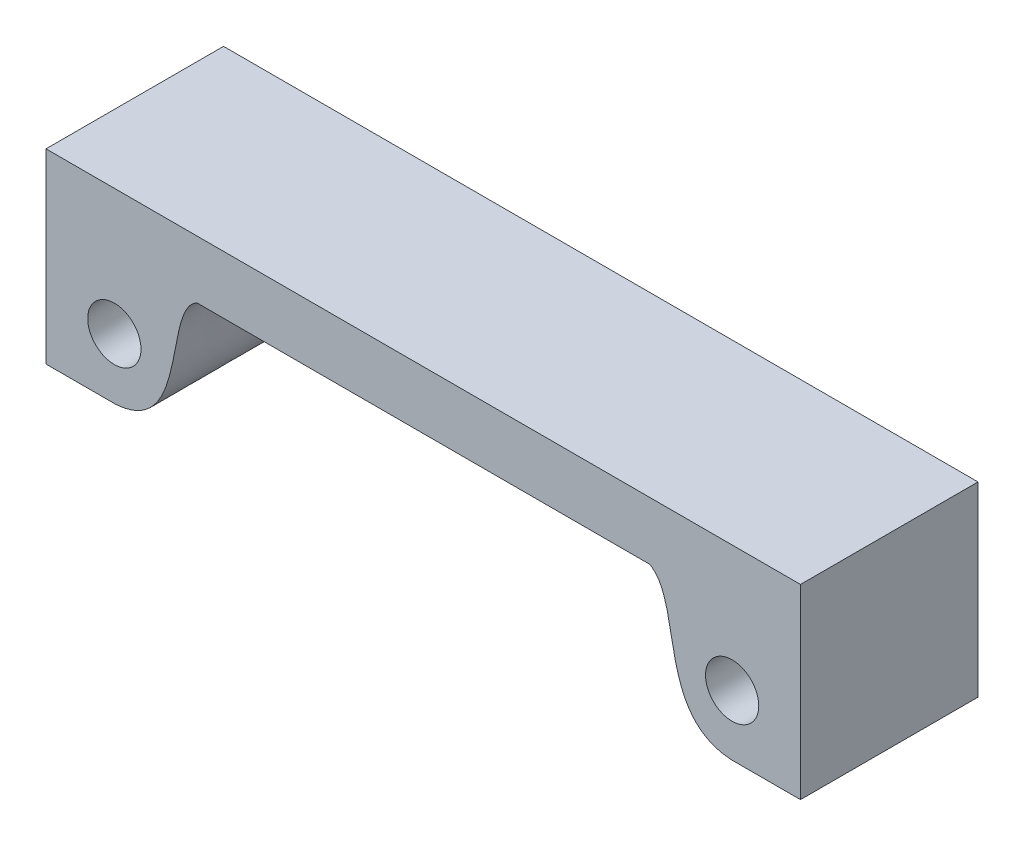
ISO-10303-21;
HEADER;
FILE_DESCRIPTION(('STEP AP214'),'2;1');
FILE_NAME('part.step','',(''),(''),'','','');
FILE_SCHEMA(('AUTOMOTIVE_DESIGN { 1 0 10303 214 1 1 1 1 }'));
ENDSEC;
DATA;
#1=APPLICATION_CONTEXT('core data for automotive mechanical design processes');
#2=APPLICATION_PROTOCOL_DEFINITION('international standard','automotive_design',2000,#1);
#3=PRODUCT_CONTEXT('',#1,'mechanical');
#4=PRODUCT('Part','Part','',(#3));
#5=PRODUCT_RELATED_PRODUCT_CATEGORY('part','',(#4));
#6=PRODUCT_DEFINITION_FORMATION('','',#4);
#7=PRODUCT_DEFINITION_CONTEXT('part definition',#1,'design');
#8=PRODUCT_DEFINITION('design','',#6,#7);
#9=PRODUCT_DEFINITION_SHAPE('','',#8);
#10=(LENGTH_UNIT() NAMED_UNIT(*) SI_UNIT(.MILLI.,.METRE.));
#11=(NAMED_UNIT(*) PLANE_ANGLE_UNIT() SI_UNIT($,.RADIAN.));
#12=(NAMED_UNIT(*) SI_UNIT($,.STERADIAN.) SOLID_ANGLE_UNIT());
#13=UNCERTAINTY_MEASURE_WITH_UNIT(LENGTH_MEASURE(1.E-05),#10,'distance_accuracy_value','');
#14=(GEOMETRIC_REPRESENTATION_CONTEXT(3) GLOBAL_UNCERTAINTY_ASSIGNED_CONTEXT((#13)) GLOBAL_UNIT_ASSIGNED_CONTEXT((#10,
#11,#12)) REPRESENTATION_CONTEXT('',''));
#15=CARTESIAN_POINT('',(0.,0.,0.));
#16=DIRECTION('',(0.,0.,1.));
#17=DIRECTION('',(1.,0.,0.));
#18=AXIS2_PLACEMENT_3D('',#15,#16,#17);
#19=CARTESIAN_POINT('',(-42.5,-10.,20.));
#20=DIRECTION('',(0.,1.,0.));
#21=DIRECTION('',(0.,0.,1.));
#22=AXIS2_PLACEMENT_3D('',#19,#20,#21);
#23=PLANE('',#22);
#24=DIRECTION('',(1.,0.,0.));
#25=VECTOR('',#24,1.);
#26=CARTESIAN_POINT('',(-42.5,-10.,0.));
#27=LINE('',#26,#25);
#28=CARTESIAN_POINT('',(-42.5,-10.,0.));
#29=VERTEX_POINT('',#28);
#30=CARTESIAN_POINT('',(-34.6378759304394,-10.,0.));
#31=VERTEX_POINT('',#30);
#32=EDGE_CURVE('E122',#29,#31,#27,.T.);
#33=ORIENTED_EDGE('',*,*,#32,.T.);
#34=DIRECTION('',(0.,0.,1.));
#35=VECTOR('',#34,1.);
#36=CARTESIAN_POINT('',(-34.6378759304394,-10.,0.));
#37=LINE('',#36,#35);
#38=CARTESIAN_POINT('',(-34.6378759304394,-10.,20.));
#39=VERTEX_POINT('',#38);
#40=EDGE_CURVE('E106',#31,#39,#37,.T.);
#41=ORIENTED_EDGE('',*,*,#40,.T.);
#42=DIRECTION('',(1.,0.,0.));
#43=VECTOR('',#42,1.);
#44=CARTESIAN_POINT('',(-42.5,-10.,20.));
#45=LINE('',#44,#43);
#46=CARTESIAN_POINT('',(-42.5,-10.,20.));
#47=VERTEX_POINT('',#46);
#48=EDGE_CURVE('E139',#47,#39,#45,.T.);
#49=ORIENTED_EDGE('',*,*,#48,.F.);
#50=DIRECTION('',(0.,0.,-1.));
#51=VECTOR('',#50,1.);
#52=CARTESIAN_POINT('',(-42.5,-10.,20.));
#53=LINE('',#52,#51);
#54=EDGE_CURVE('E129',#47,#29,#53,.T.);
#55=ORIENTED_EDGE('',*,*,#54,.T.);
#56=EDGE_LOOP('',(#33,#41,#49,#55));
#57=FACE_BOUND('',#56,.T.);
#58=ADVANCED_FACE('F31',(#57),#23,.F.);
#59=CARTESIAN_POINT('',(42.5,11.,20.));
#60=DIRECTION('',(-1.,0.,0.));
#61=DIRECTION('',(0.,-1.,0.));
#62=AXIS2_PLACEMENT_3D('',#59,#60,#61);
#63=PLANE('',#62);
#64=DIRECTION('',(0.,1.,0.));
#65=VECTOR('',#64,1.);
#66=CARTESIAN_POINT('',(42.5,11.,0.));
#67=LINE('',#66,#65);
#68=CARTESIAN_POINT('',(42.5,-10.,0.));
#69=VERTEX_POINT('',#68);
#70=CARTESIAN_POINT('',(42.5,11.,0.));
#71=VERTEX_POINT('',#70);
#72=EDGE_CURVE('E147',#69,#71,#67,.T.);
#73=ORIENTED_EDGE('',*,*,#72,.T.);
#74=DIRECTION('',(0.,0.,-1.));
#75=VECTOR('',#74,1.);
#76=CARTESIAN_POINT('',(42.5,11.,20.));
#77=LINE('',#76,#75);
#78=CARTESIAN_POINT('',(42.5,11.,20.));
#79=VERTEX_POINT('',#78);
#80=EDGE_CURVE('E11',#79,#71,#77,.T.);
#81=ORIENTED_EDGE('',*,*,#80,.F.);
#82=DIRECTION('',(0.,1.,0.));
#83=VECTOR('',#82,1.);
#84=CARTESIAN_POINT('',(42.5,11.,20.));
#85=LINE('',#84,#83);
#86=CARTESIAN_POINT('',(42.5,-10.,20.));
#87=VERTEX_POINT('',#86);
#88=EDGE_CURVE('E130',#87,#79,#85,.T.);
#89=ORIENTED_EDGE('',*,*,#88,.F.);
#90=DIRECTION('',(0.,0.,-1.));
#91=VECTOR('',#90,1.);
#92=CARTESIAN_POINT('',(42.5,-10.,20.));
#93=LINE('',#92,#91);
#94=EDGE_CURVE('E137',#87,#69,#93,.T.);
#95=ORIENTED_EDGE('',*,*,#94,.T.);
#96=EDGE_LOOP('',(#73,#81,#89,#95));
#97=FACE_BOUND('',#96,.T.);
#98=ADVANCED_FACE('F33',(#97),#63,.F.);
#99=CARTESIAN_POINT('',(-42.5,11.,20.));
#100=DIRECTION('',(0.,-1.,0.));
#101=DIRECTION('',(0.,0.,-1.));
#102=AXIS2_PLACEMENT_3D('',#99,#100,#101);
#103=PLANE('',#102);
#104=DIRECTION('',(-1.,0.,0.));
#105=VECTOR('',#104,1.);
#106=CARTESIAN_POINT('',(-42.5,11.,0.));
#107=LINE('',#106,#105);
#108=CARTESIAN_POINT('',(-42.5,11.,0.));
#109=VERTEX_POINT('',#108);
#110=EDGE_CURVE('E146',#71,#109,#107,.T.);
#111=ORIENTED_EDGE('',*,*,#110,.T.);
#112=DIRECTION('',(0.,0.,-1.));
#113=VECTOR('',#112,1.);
#114=CARTESIAN_POINT('',(-42.5,11.,20.));
#115=LINE('',#114,#113);
#116=CARTESIAN_POINT('',(-42.5,11.,20.));
#117=VERTEX_POINT('',#116);
#118=EDGE_CURVE('E39',#117,#109,#115,.T.);
#119=ORIENTED_EDGE('',*,*,#118,.F.);
#120=DIRECTION('',(-1.,0.,0.));
#121=VECTOR('',#120,1.);
#122=CARTESIAN_POINT('',(-42.5,11.,20.));
#123=LINE('',#122,#121);
#124=EDGE_CURVE('E84',#79,#117,#123,.T.);
#125=ORIENTED_EDGE('',*,*,#124,.F.);
#126=ORIENTED_EDGE('',*,*,#80,.T.);
#127=EDGE_LOOP('',(#111,#119,#125,#126));
#128=FACE_BOUND('',#127,.T.);
#129=ADVANCED_FACE('F224',(#128),#103,.F.);
#130=CARTESIAN_POINT('',(-42.5,11.,20.));
#131=DIRECTION('',(1.,0.,0.));
#132=DIRECTION('',(0.,0.,-1.));
#133=AXIS2_PLACEMENT_3D('',#130,#131,#132);
#134=PLANE('',#133);
#135=DIRECTION('',(0.,-1.,0.));
#136=VECTOR('',#135,1.);
#137=CARTESIAN_POINT('',(-42.5,11.,0.));
#138=LINE('',#137,#136);
#139=EDGE_CURVE('E133',#109,#29,#138,.T.);
#140=ORIENTED_EDGE('',*,*,#139,.T.);
#141=ORIENTED_EDGE('',*,*,#54,.F.);
#142=DIRECTION('',(0.,-1.,0.));
#143=VECTOR('',#142,1.);
#144=CARTESIAN_POINT('',(-42.5,11.,20.));
#145=LINE('',#144,#143);
#146=EDGE_CURVE('E144',#117,#47,#145,.T.);
#147=ORIENTED_EDGE('',*,*,#146,.F.);
#148=ORIENTED_EDGE('',*,*,#118,.T.);
#149=EDGE_LOOP('',(#140,#141,#147,#148));
#150=FACE_BOUND('',#149,.T.);
#151=ADVANCED_FACE('F143',(#150),#134,.F.);
#152=CARTESIAN_POINT('',(34.6378759304394,-10.,20.));
#153=VERTEX_POINT('',#152);
#154=EDGE_CURVE('E55',#153,#87,#45,.T.);
#155=ORIENTED_EDGE('',*,*,#154,.F.);
#156=DIRECTION('',(0.,0.,1.));
#157=VECTOR('',#156,1.);
#158=CARTESIAN_POINT('',(34.6378759304394,-10.,0.));
#159=LINE('',#158,#157);
#160=CARTESIAN_POINT('',(34.6378759304394,-10.,0.));
#161=VERTEX_POINT('',#160);
#162=EDGE_CURVE('E116',#161,#153,#159,.T.);
#163=ORIENTED_EDGE('',*,*,#162,.F.);
#164=EDGE_CURVE('E77',#161,#69,#27,.T.);
#165=ORIENTED_EDGE('',*,*,#164,.T.);
#166=ORIENTED_EDGE('',*,*,#94,.F.);
#167=EDGE_LOOP('',(#155,#163,#165,#166));
#168=FACE_BOUND('',#167,.T.);
#169=ADVANCED_FACE('F217',(#168),#23,.F.);
#170=CARTESIAN_POINT('',(42.5,-10.,20.));
#171=DIRECTION('',(0.,0.,1.));
#172=DIRECTION('',(1.,0.,0.));
#173=AXIS2_PLACEMENT_3D('',#170,#171,#172);
#174=PLANE('',#173);
#175=CARTESIAN_POINT('',(-25.5,4.47239623934017,20.));
#176=CARTESIAN_POINT('',(-29.3281769334763,2.42753986906404,20.));
#177=CARTESIAN_POINT('',(-26.2628624238646,-9.38066207497828,20.));
#178=CARTESIAN_POINT('',(-34.6378759304394,-10.,20.));
#179=B_SPLINE_CURVE_WITH_KNOTS('',3,(#175,#176,#177,#178),.UNSPECIFIED.,.F.,.F.,(4,4),(0.,1.),.UNSPECIFIED.);
#180=CARTESIAN_POINT('',(-25.5,4.47239623934017,20.));
#181=VERTEX_POINT('',#180);
#182=EDGE_CURVE('E111',#181,#39,#179,.T.);
#183=ORIENTED_EDGE('',*,*,#182,.F.);
#184=DIRECTION('',(-1.,0.,0.));
#185=VECTOR('',#184,1.);
#186=CARTESIAN_POINT('',(-25.5,4.47239623934017,20.));
#187=LINE('',#186,#185);
#188=CARTESIAN_POINT('',(25.5,4.47239623934017,20.));
#189=VERTEX_POINT('',#188);
#190=EDGE_CURVE('E125',#189,#181,#187,.T.);
#191=ORIENTED_EDGE('',*,*,#190,.F.);
#192=CARTESIAN_POINT('',(34.6378759304394,-10.,20.));
#193=CARTESIAN_POINT('',(26.2628624238646,-9.38066207497828,20.));
#194=CARTESIAN_POINT('',(29.3281769334763,2.42753986906404,20.));
#195=CARTESIAN_POINT('',(25.5,4.47239623934017,20.));
#196=B_SPLINE_CURVE_WITH_KNOTS('',3,(#192,#193,#194,#195),.UNSPECIFIED.,.F.,.F.,(4,4),(0.,1.),.UNSPECIFIED.);
#197=EDGE_CURVE('E173',#153,#189,#196,.T.);
#198=ORIENTED_EDGE('',*,*,#197,.F.);
#199=ORIENTED_EDGE('',*,*,#154,.T.);
#200=ORIENTED_EDGE('',*,*,#88,.T.);
#201=ORIENTED_EDGE('',*,*,#124,.T.);
#202=ORIENTED_EDGE('',*,*,#146,.T.);
#203=ORIENTED_EDGE('',*,*,#48,.T.);
#204=EDGE_LOOP('',(#183,#191,#198,#199,#200,#201,#202,#203));
#205=FACE_BOUND('',#204,.T.);
#206=CARTESIAN_POINT('',(34.8,-3.2,20.));
#207=DIRECTION('',(0.,0.,1.));
#208=DIRECTION('',(1.,0.,0.));
#209=AXIS2_PLACEMENT_3D('',#206,#207,#208);
#210=CIRCLE('',#209,3.);
#211=CARTESIAN_POINT('',(37.8,-3.2,20.));
#212=VERTEX_POINT('',#211);
#213=EDGE_CURVE('E161',#212,#212,#210,.T.);
#214=ORIENTED_EDGE('',*,*,#213,.F.);
#215=EDGE_LOOP('',(#214));
#216=FACE_BOUND('',#215,.T.);
#217=CARTESIAN_POINT('',(-34.8,-3.19999999999997,20.));
#218=DIRECTION('',(0.,0.,1.));
#219=DIRECTION('',(1.,0.,0.));
#220=AXIS2_PLACEMENT_3D('',#217,#218,#219);
#221=CIRCLE('',#220,3.);
#222=CARTESIAN_POINT('',(-31.8,-3.19999999999997,20.));
#223=VERTEX_POINT('',#222);
#224=EDGE_CURVE('E155',#223,#223,#221,.T.);
#225=ORIENTED_EDGE('',*,*,#224,.F.);
#226=EDGE_LOOP('',(#225));
#227=FACE_BOUND('',#226,.T.);
#228=ADVANCED_FACE('F214',(#205,#216,#227),#174,.T.);
#229=CARTESIAN_POINT('',(42.5,-10.,0.));
#230=DIRECTION('',(0.,0.,1.));
#231=DIRECTION('',(1.,0.,0.));
#232=AXIS2_PLACEMENT_3D('',#229,#230,#231);
#233=PLANE('',#232);
#234=CARTESIAN_POINT('',(34.8,-3.2,0.));
#235=DIRECTION('',(0.,0.,1.));
#236=DIRECTION('',(1.,0.,0.));
#237=AXIS2_PLACEMENT_3D('',#234,#235,#236);
#238=CIRCLE('',#237,3.);
#239=CARTESIAN_POINT('',(37.8,-3.2,0.));
#240=VERTEX_POINT('',#239);
#241=EDGE_CURVE('E158',#240,#240,#238,.T.);
#242=ORIENTED_EDGE('',*,*,#241,.T.);
#243=EDGE_LOOP('',(#242));
#244=FACE_BOUND('',#243,.T.);
#245=CARTESIAN_POINT('',(-34.8,-3.19999999999997,0.));
#246=DIRECTION('',(0.,0.,1.));
#247=DIRECTION('',(1.,0.,0.));
#248=AXIS2_PLACEMENT_3D('',#245,#246,#247);
#249=CIRCLE('',#248,3.);
#250=CARTESIAN_POINT('',(-31.8,-3.19999999999997,0.));
#251=VERTEX_POINT('',#250);
#252=EDGE_CURVE('E149',#251,#251,#249,.T.);
#253=ORIENTED_EDGE('',*,*,#252,.T.);
#254=EDGE_LOOP('',(#253));
#255=FACE_BOUND('',#254,.T.);
#256=DIRECTION('',(-1.,0.,0.));
#257=VECTOR('',#256,1.);
#258=CARTESIAN_POINT('',(-25.5,4.47239623934017,0.));
#259=LINE('',#258,#257);
#260=CARTESIAN_POINT('',(25.5,4.47239623934017,0.));
#261=VERTEX_POINT('',#260);
#262=CARTESIAN_POINT('',(-25.5,4.47239623934017,0.));
#263=VERTEX_POINT('',#262);
#264=EDGE_CURVE('E46',#261,#263,#259,.T.);
#265=ORIENTED_EDGE('',*,*,#264,.T.);
#266=CARTESIAN_POINT('',(-25.5,4.47239623934017,0.));
#267=CARTESIAN_POINT('',(-29.3281769334763,2.42753986906404,0.));
#268=CARTESIAN_POINT('',(-26.2628624238646,-9.38066207497828,0.));
#269=CARTESIAN_POINT('',(-34.6378759304394,-10.,0.));
#270=B_SPLINE_CURVE_WITH_KNOTS('',3,(#266,#267,#268,#269),.UNSPECIFIED.,.F.,.F.,(4,4),(0.,1.),.UNSPECIFIED.);
#271=EDGE_CURVE('E109',#263,#31,#270,.T.);
#272=ORIENTED_EDGE('',*,*,#271,.T.);
#273=ORIENTED_EDGE('',*,*,#32,.F.);
#274=ORIENTED_EDGE('',*,*,#139,.F.);
#275=ORIENTED_EDGE('',*,*,#110,.F.);
#276=ORIENTED_EDGE('',*,*,#72,.F.);
#277=ORIENTED_EDGE('',*,*,#164,.F.);
#278=CARTESIAN_POINT('',(34.6378759304394,-10.,0.));
#279=CARTESIAN_POINT('',(26.2628624238646,-9.38066207497828,0.));
#280=CARTESIAN_POINT('',(29.3281769334763,2.42753986906404,0.));
#281=CARTESIAN_POINT('',(25.5,4.47239623934017,0.));
#282=B_SPLINE_CURVE_WITH_KNOTS('',3,(#278,#279,#280,#281),.UNSPECIFIED.,.F.,.F.,(4,4),(0.,1.),.UNSPECIFIED.);
#283=EDGE_CURVE('E124',#161,#261,#282,.T.);
#284=ORIENTED_EDGE('',*,*,#283,.T.);
#285=EDGE_LOOP('',(#265,#272,#273,#274,#275,#276,#277,#284));
#286=FACE_BOUND('',#285,.T.);
#287=ADVANCED_FACE('F120',(#244,#255,#286),#233,.F.);
#288=CARTESIAN_POINT('',(-34.8,-3.19999999999997,0.));
#289=DIRECTION('',(0.,0.,1.));
#290=DIRECTION('',(1.,0.,0.));
#291=AXIS2_PLACEMENT_3D('',#288,#289,#290);
#292=CYLINDRICAL_SURFACE('',#291,3.);
#293=ORIENTED_EDGE('',*,*,#252,.F.);
#294=EDGE_LOOP('',(#293));
#295=FACE_BOUND('',#294,.T.);
#296=ORIENTED_EDGE('',*,*,#224,.T.);
#297=EDGE_LOOP('',(#296));
#298=FACE_BOUND('',#297,.T.);
#299=ADVANCED_FACE('F209',(#295,#298),#292,.F.);
#300=CARTESIAN_POINT('',(34.8,-3.2,0.));
#301=DIRECTION('',(0.,0.,1.));
#302=DIRECTION('',(1.,0.,0.));
#303=AXIS2_PLACEMENT_3D('',#300,#301,#302);
#304=CYLINDRICAL_SURFACE('',#303,3.);
#305=ORIENTED_EDGE('',*,*,#241,.F.);
#306=EDGE_LOOP('',(#305));
#307=FACE_BOUND('',#306,.T.);
#308=ORIENTED_EDGE('',*,*,#213,.T.);
#309=EDGE_LOOP('',(#308));
#310=FACE_BOUND('',#309,.T.);
#311=ADVANCED_FACE('F206',(#307,#310),#304,.F.);
#312=DIRECTION('',(0.,0.,1.));
#313=VECTOR('',#312,1.);
#314=SURFACE_OF_LINEAR_EXTRUSION('',#270,#313);
#315=ORIENTED_EDGE('',*,*,#182,.T.);
#316=ORIENTED_EDGE('',*,*,#40,.F.);
#317=ORIENTED_EDGE('',*,*,#271,.F.);
#318=DIRECTION('',(0.,0.,1.));
#319=VECTOR('',#318,1.);
#320=CARTESIAN_POINT('',(-25.5,4.47239623934017,0.));
#321=LINE('',#320,#319);
#322=EDGE_CURVE('E164',#263,#181,#321,.T.);
#323=ORIENTED_EDGE('',*,*,#322,.T.);
#324=EDGE_LOOP('',(#315,#316,#317,#323));
#325=FACE_BOUND('',#324,.T.);
#326=ADVANCED_FACE('F108',(#325),#314,.F.);
#327=CARTESIAN_POINT('',(-25.5,4.47239623934017,0.));
#328=DIRECTION('',(0.,1.,0.));
#329=DIRECTION('',(0.,0.,1.));
#330=AXIS2_PLACEMENT_3D('',#327,#328,#329);
#331=PLANE('',#330);
#332=ORIENTED_EDGE('',*,*,#190,.T.);
#333=ORIENTED_EDGE('',*,*,#322,.F.);
#334=ORIENTED_EDGE('',*,*,#264,.F.);
#335=DIRECTION('',(0.,0.,1.));
#336=VECTOR('',#335,1.);
#337=CARTESIAN_POINT('',(25.5,4.47239623934017,0.));
#338=LINE('',#337,#336);
#339=EDGE_CURVE('E168',#261,#189,#338,.T.);
#340=ORIENTED_EDGE('',*,*,#339,.T.);
#341=EDGE_LOOP('',(#332,#333,#334,#340));
#342=FACE_BOUND('',#341,.T.);
#343=ADVANCED_FACE('F202',(#342),#331,.F.);
#344=DIRECTION('',(0.,0.,1.));
#345=VECTOR('',#344,1.);
#346=SURFACE_OF_LINEAR_EXTRUSION('',#282,#345);
#347=ORIENTED_EDGE('',*,*,#197,.T.);
#348=ORIENTED_EDGE('',*,*,#339,.F.);
#349=ORIENTED_EDGE('',*,*,#283,.F.);
#350=ORIENTED_EDGE('',*,*,#162,.T.);
#351=EDGE_LOOP('',(#347,#348,#349,#350));
#352=FACE_BOUND('',#351,.T.);
#353=ADVANCED_FACE('F198',(#352),#346,.F.);
#354=CLOSED_SHELL('',(#58,#98,#129,#151,#169,#228,#287,#299,#311,#326,#343,#353));
#355=MANIFOLD_SOLID_BREP('B2',#354);
#356=ADVANCED_BREP_SHAPE_REPRESENTATION('',(#18,#355),#14);
#357=SHAPE_DEFINITION_REPRESENTATION(#9,#356);
ENDSEC;
END-ISO-10303-21;
